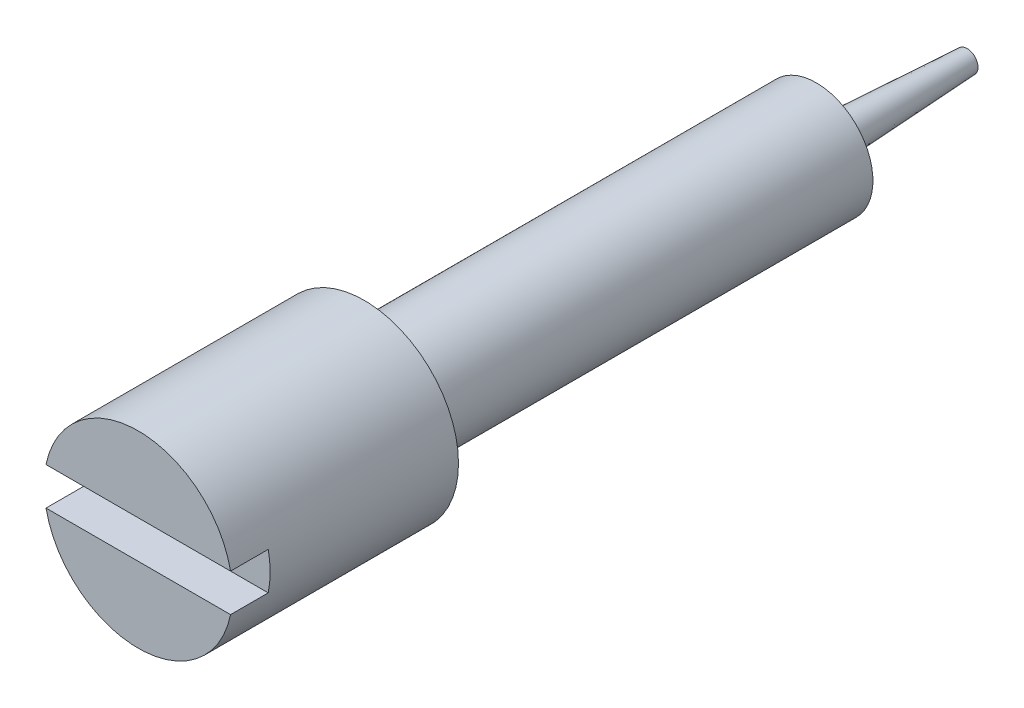
ISO-10303-21;
HEADER;
FILE_DESCRIPTION(('STEP AP214'),'2;1');
FILE_NAME('part.step','',(''),(''),'','','');
FILE_SCHEMA(('AUTOMOTIVE_DESIGN { 1 0 10303 214 1 1 1 1 }'));
ENDSEC;
DATA;
#1=APPLICATION_CONTEXT('core data for automotive mechanical design processes');
#2=APPLICATION_PROTOCOL_DEFINITION('international standard','automotive_design',2000,#1);
#3=PRODUCT_CONTEXT('',#1,'mechanical');
#4=PRODUCT('Part','Part','',(#3));
#5=PRODUCT_RELATED_PRODUCT_CATEGORY('part','',(#4));
#6=PRODUCT_DEFINITION_FORMATION('','',#4);
#7=PRODUCT_DEFINITION_CONTEXT('part definition',#1,'design');
#8=PRODUCT_DEFINITION('design','',#6,#7);
#9=PRODUCT_DEFINITION_SHAPE('','',#8);
#10=(LENGTH_UNIT() NAMED_UNIT(*) SI_UNIT(.MILLI.,.METRE.));
#11=(NAMED_UNIT(*) PLANE_ANGLE_UNIT() SI_UNIT($,.RADIAN.));
#12=(NAMED_UNIT(*) SI_UNIT($,.STERADIAN.) SOLID_ANGLE_UNIT());
#13=UNCERTAINTY_MEASURE_WITH_UNIT(LENGTH_MEASURE(1.E-05),#10,'distance_accuracy_value','');
#14=(GEOMETRIC_REPRESENTATION_CONTEXT(3) GLOBAL_UNCERTAINTY_ASSIGNED_CONTEXT((#13)) GLOBAL_UNIT_ASSIGNED_CONTEXT((#10,
#11,#12)) REPRESENTATION_CONTEXT('',''));
#15=CARTESIAN_POINT('',(0.,0.,0.));
#16=DIRECTION('',(0.,0.,1.));
#17=DIRECTION('',(1.,0.,0.));
#18=AXIS2_PLACEMENT_3D('',#15,#16,#17);
#19=CARTESIAN_POINT('',(0.,0.,6.));
#20=DIRECTION('',(0.,0.,1.));
#21=DIRECTION('',(1.,0.,0.));
#22=AXIS2_PLACEMENT_3D('',#19,#20,#21);
#23=PLANE('',#22);
#24=DIRECTION('',(1.,0.,0.));
#25=VECTOR('',#24,1.);
#26=CARTESIAN_POINT('',(0.,-0.500000000000005,6.));
#27=LINE('',#26,#25);
#28=CARTESIAN_POINT('',(-2.44948974278324,-0.500000000000003,6.));
#29=VERTEX_POINT('',#28);
#30=CARTESIAN_POINT('',(2.44948974278317,-0.500000000000006,6.00000000000003));
#31=VERTEX_POINT('',#30);
#32=EDGE_CURVE('E86',#29,#31,#27,.T.);
#33=ORIENTED_EDGE('',*,*,#32,.F.);
#34=CARTESIAN_POINT('',(0.,0.,6.));
#35=DIRECTION('',(0.,0.,1.));
#36=DIRECTION('',(1.,0.,0.));
#37=AXIS2_PLACEMENT_3D('',#34,#35,#36);
#38=CIRCLE('',#37,2.5);
#39=EDGE_CURVE('E98',#29,#31,#38,.T.);
#40=ORIENTED_EDGE('',*,*,#39,.T.);
#41=EDGE_LOOP('',(#33,#40));
#42=FACE_BOUND('',#41,.T.);
#43=ADVANCED_FACE('F36',(#42),#23,.T.);
#44=CARTESIAN_POINT('',(0.,0.,6.));
#45=DIRECTION('',(0.,0.,-1.));
#46=DIRECTION('',(-1.,0.,0.));
#47=AXIS2_PLACEMENT_3D('',#44,#45,#46);
#48=CYLINDRICAL_SURFACE('',#47,2.5);
#49=ORIENTED_EDGE('',*,*,#39,.F.);
#50=DIRECTION('',(0.,0.,-1.));
#51=VECTOR('',#50,1.);
#52=CARTESIAN_POINT('',(-2.44948974278324,-0.500000000000003,6.));
#53=LINE('',#52,#51);
#54=CARTESIAN_POINT('',(-2.44948974278323,-0.500000000000004,5.));
#55=VERTEX_POINT('',#54);
#56=EDGE_CURVE('E104',#29,#55,#53,.T.);
#57=ORIENTED_EDGE('',*,*,#56,.T.);
#58=CARTESIAN_POINT('',(0.,0.,5.));
#59=DIRECTION('',(0.,0.,1.));
#60=DIRECTION('',(1.,0.,0.));
#61=AXIS2_PLACEMENT_3D('',#58,#59,#60);
#62=CIRCLE('',#61,2.5);
#63=CARTESIAN_POINT('',(-2.44948974278321,0.499999999999998,5.));
#64=VERTEX_POINT('',#63);
#65=EDGE_CURVE('E94',#64,#55,#62,.T.);
#66=ORIENTED_EDGE('',*,*,#65,.F.);
#67=DIRECTION('',(0.,0.,-1.));
#68=VECTOR('',#67,1.);
#69=CARTESIAN_POINT('',(-2.44948974278324,0.500000000000001,6.));
#70=LINE('',#69,#68);
#71=CARTESIAN_POINT('',(-2.44948974278324,0.500000000000001,6.));
#72=VERTEX_POINT('',#71);
#73=EDGE_CURVE('E81',#64,#72,#70,.F.);
#74=ORIENTED_EDGE('',*,*,#73,.T.);
#75=CARTESIAN_POINT('',(2.44948974278317,0.499999999999996,6.00000000000003));
#76=VERTEX_POINT('',#75);
#77=EDGE_CURVE('E87',#76,#72,#38,.T.);
#78=ORIENTED_EDGE('',*,*,#77,.F.);
#79=DIRECTION('',(0.,0.,-1.));
#80=VECTOR('',#79,1.);
#81=CARTESIAN_POINT('',(2.44948974278317,0.499999999999996,6.00000000000003));
#82=LINE('',#81,#80);
#83=CARTESIAN_POINT('',(2.44948974278315,0.499999999999999,5.00000000000002));
#84=VERTEX_POINT('',#83);
#85=EDGE_CURVE('E53',#76,#84,#82,.T.);
#86=ORIENTED_EDGE('',*,*,#85,.T.);
#87=CARTESIAN_POINT('',(2.44948974278315,-0.500000000000004,5.00000000000003));
#88=VERTEX_POINT('',#87);
#89=EDGE_CURVE('E40',#88,#84,#62,.T.);
#90=ORIENTED_EDGE('',*,*,#89,.F.);
#91=DIRECTION('',(0.,0.,-1.));
#92=VECTOR('',#91,1.);
#93=CARTESIAN_POINT('',(2.44948974278317,-0.500000000000006,6.00000000000003));
#94=LINE('',#93,#92);
#95=EDGE_CURVE('E61',#88,#31,#94,.F.);
#96=ORIENTED_EDGE('',*,*,#95,.T.);
#97=EDGE_LOOP('',(#49,#57,#66,#74,#78,#86,#90,#96));
#98=FACE_BOUND('',#97,.T.);
#99=CARTESIAN_POINT('',(0.,0.,0.));
#100=DIRECTION('',(0.,0.,1.));
#101=DIRECTION('',(1.,0.,0.));
#102=AXIS2_PLACEMENT_3D('',#99,#100,#101);
#103=CIRCLE('',#102,2.5);
#104=CARTESIAN_POINT('',(2.50000000000001,0.,0.));
#105=VERTEX_POINT('',#104);
#106=EDGE_CURVE('E101',#105,#105,#103,.T.);
#107=ORIENTED_EDGE('',*,*,#106,.T.);
#108=EDGE_LOOP('',(#107));
#109=FACE_BOUND('',#108,.T.);
#110=ADVANCED_FACE('F38',(#98,#109),#48,.T.);
#111=DIRECTION('',(-1.,0.,0.));
#112=VECTOR('',#111,1.);
#113=CARTESIAN_POINT('',(0.,0.500000000000001,6.00000000000001));
#114=LINE('',#113,#112);
#115=EDGE_CURVE('E78',#76,#72,#114,.T.);
#116=ORIENTED_EDGE('',*,*,#115,.F.);
#117=ORIENTED_EDGE('',*,*,#77,.T.);
#118=EDGE_LOOP('',(#116,#117));
#119=FACE_BOUND('',#118,.T.);
#120=ADVANCED_FACE('F97',(#119),#23,.T.);
#121=CARTESIAN_POINT('',(0.,0.,0.));
#122=DIRECTION('',(0.,0.,1.));
#123=DIRECTION('',(1.,0.,0.));
#124=AXIS2_PLACEMENT_3D('',#121,#122,#123);
#125=PLANE('',#124);
#126=CARTESIAN_POINT('',(0.,0.,0.));
#127=DIRECTION('',(0.,0.,-1.));
#128=DIRECTION('',(-1.,0.,0.));
#129=AXIS2_PLACEMENT_3D('',#126,#127,#128);
#130=CIRCLE('',#129,1.5);
#131=CARTESIAN_POINT('',(-1.50000000000001,0.,0.));
#132=VERTEX_POINT('',#131);
#133=EDGE_CURVE('E45',#132,#132,#130,.T.);
#134=ORIENTED_EDGE('',*,*,#133,.F.);
#135=EDGE_LOOP('',(#134));
#136=FACE_BOUND('',#135,.T.);
#137=ORIENTED_EDGE('',*,*,#106,.F.);
#138=EDGE_LOOP('',(#137));
#139=FACE_BOUND('',#138,.T.);
#140=ADVANCED_FACE('F130',(#136,#139),#125,.F.);
#141=CARTESIAN_POINT('',(0.,0.,5.));
#142=DIRECTION('',(0.,0.,1.));
#143=DIRECTION('',(1.,0.,0.));
#144=AXIS2_PLACEMENT_3D('',#141,#142,#143);
#145=PLANE('',#144);
#146=ORIENTED_EDGE('',*,*,#65,.T.);
#147=DIRECTION('',(1.,0.,0.));
#148=VECTOR('',#147,1.);
#149=CARTESIAN_POINT('',(-2.6842977531233,-0.500000000000003,5.00000000000002));
#150=LINE('',#149,#148);
#151=EDGE_CURVE('E95',#55,#88,#150,.T.);
#152=ORIENTED_EDGE('',*,*,#151,.T.);
#153=ORIENTED_EDGE('',*,*,#89,.T.);
#154=DIRECTION('',(-1.,0.,0.));
#155=VECTOR('',#154,1.);
#156=CARTESIAN_POINT('',(-2.6842977531233,0.499999999999999,5.));
#157=LINE('',#156,#155);
#158=EDGE_CURVE('E118',#84,#64,#157,.T.);
#159=ORIENTED_EDGE('',*,*,#158,.T.);
#160=EDGE_LOOP('',(#146,#152,#153,#159));
#161=FACE_BOUND('',#160,.T.);
#162=ADVANCED_FACE('F134',(#161),#145,.T.);
#163=CARTESIAN_POINT('',(-2.6842977531233,-0.500000000000003,5.00000000000002));
#164=DIRECTION('',(0.,-1.,0.));
#165=DIRECTION('',(0.,0.,-1.));
#166=AXIS2_PLACEMENT_3D('',#163,#164,#165);
#167=PLANE('',#166);
#168=ORIENTED_EDGE('',*,*,#32,.T.);
#169=ORIENTED_EDGE('',*,*,#95,.F.);
#170=ORIENTED_EDGE('',*,*,#151,.F.);
#171=ORIENTED_EDGE('',*,*,#56,.F.);
#172=EDGE_LOOP('',(#168,#169,#170,#171));
#173=FACE_BOUND('',#172,.T.);
#174=ADVANCED_FACE('F121',(#173),#167,.F.);
#175=CARTESIAN_POINT('',(-2.6842977531233,0.499999999999999,5.));
#176=DIRECTION('',(0.,1.,0.));
#177=DIRECTION('',(0.,0.,1.));
#178=AXIS2_PLACEMENT_3D('',#175,#176,#177);
#179=PLANE('',#178);
#180=ORIENTED_EDGE('',*,*,#115,.T.);
#181=ORIENTED_EDGE('',*,*,#73,.F.);
#182=ORIENTED_EDGE('',*,*,#158,.F.);
#183=ORIENTED_EDGE('',*,*,#85,.F.);
#184=EDGE_LOOP('',(#180,#181,#182,#183));
#185=FACE_BOUND('',#184,.T.);
#186=ADVANCED_FACE('F80',(#185),#179,.F.);
#187=CARTESIAN_POINT('',(0.,0.,-12.));
#188=DIRECTION('',(0.,0.,1.));
#189=DIRECTION('',(1.,0.,0.));
#190=AXIS2_PLACEMENT_3D('',#187,#188,#189);
#191=CYLINDRICAL_SURFACE('',#190,1.5);
#192=CARTESIAN_POINT('',(0.,0.,-12.));
#193=DIRECTION('',(0.,0.,-1.));
#194=DIRECTION('',(-1.,0.,0.));
#195=AXIS2_PLACEMENT_3D('',#192,#193,#194);
#196=CIRCLE('',#195,1.5);
#197=CARTESIAN_POINT('',(-1.50000000000003,0.,-12.));
#198=VERTEX_POINT('',#197);
#199=EDGE_CURVE('E116',#198,#198,#196,.T.);
#200=ORIENTED_EDGE('',*,*,#199,.F.);
#201=EDGE_LOOP('',(#200));
#202=FACE_BOUND('',#201,.T.);
#203=ORIENTED_EDGE('',*,*,#133,.T.);
#204=EDGE_LOOP('',(#203));
#205=FACE_BOUND('',#204,.T.);
#206=ADVANCED_FACE('F147',(#202,#205),#191,.T.);
#207=CARTESIAN_POINT('',(0.,0.,-12.));
#208=DIRECTION('',(0.,0.,-1.));
#209=DIRECTION('',(-1.,0.,0.));
#210=AXIS2_PLACEMENT_3D('',#207,#208,#209);
#211=PLANE('',#210);
#212=CARTESIAN_POINT('',(0.,0.,-12.));
#213=DIRECTION('',(0.,0.,-1.));
#214=DIRECTION('',(-1.,0.,0.));
#215=AXIS2_PLACEMENT_3D('',#212,#213,#214);
#216=CIRCLE('',#215,0.5);
#217=CARTESIAN_POINT('',(-0.50000000000003,0.,-12.));
#218=VERTEX_POINT('',#217);
#219=EDGE_CURVE('E11',#218,#218,#216,.T.);
#220=ORIENTED_EDGE('',*,*,#219,.F.);
#221=EDGE_LOOP('',(#220));
#222=FACE_BOUND('',#221,.T.);
#223=ORIENTED_EDGE('',*,*,#199,.T.);
#224=EDGE_LOOP('',(#223));
#225=FACE_BOUND('',#224,.T.);
#226=ADVANCED_FACE('F153',(#222,#225),#211,.T.);
#227=CARTESIAN_POINT('',(0.,0.,-12.));
#228=DIRECTION('',(0.,0.,1.));
#229=DIRECTION('',(-1.,0.,0.));
#230=AXIS2_PLACEMENT_3D('',#227,#228,#229);
#231=CONICAL_SURFACE('',#230,0.5,0.0523598775598299);
#232=CARTESIAN_POINT('',(0.,0.,-16.));
#233=DIRECTION('',(0.,0.,-1.));
#234=DIRECTION('',(-1.,0.,0.));
#235=AXIS2_PLACEMENT_3D('',#232,#233,#234);
#236=CIRCLE('',#235,0.290368882867835);
#237=CARTESIAN_POINT('',(-0.290368882867864,0.,-16.));
#238=VERTEX_POINT('',#237);
#239=EDGE_CURVE('E163',#238,#238,#236,.T.);
#240=ORIENTED_EDGE('',*,*,#239,.F.);
#241=EDGE_LOOP('',(#240));
#242=FACE_BOUND('',#241,.T.);
#243=ORIENTED_EDGE('',*,*,#219,.T.);
#244=EDGE_LOOP('',(#243));
#245=FACE_BOUND('',#244,.T.);
#246=ADVANCED_FACE('F158',(#242,#245),#231,.T.);
#247=CARTESIAN_POINT('',(0.,0.,-16.));
#248=DIRECTION('',(0.,0.,-1.));
#249=DIRECTION('',(-1.,0.,0.));
#250=AXIS2_PLACEMENT_3D('',#247,#248,#249);
#251=PLANE('',#250);
#252=ORIENTED_EDGE('',*,*,#239,.T.);
#253=EDGE_LOOP('',(#252));
#254=FACE_BOUND('',#253,.T.);
#255=ADVANCED_FACE('F167',(#254),#251,.T.);
#256=CLOSED_SHELL('',(#43,#110,#120,#140,#162,#174,#186,#206,#226,#246,#255));
#257=MANIFOLD_SOLID_BREP('B2',#256);
#258=ADVANCED_BREP_SHAPE_REPRESENTATION('',(#18,#257),#14);
#259=SHAPE_DEFINITION_REPRESENTATION(#9,#258);
ENDSEC;
END-ISO-10303-21;
